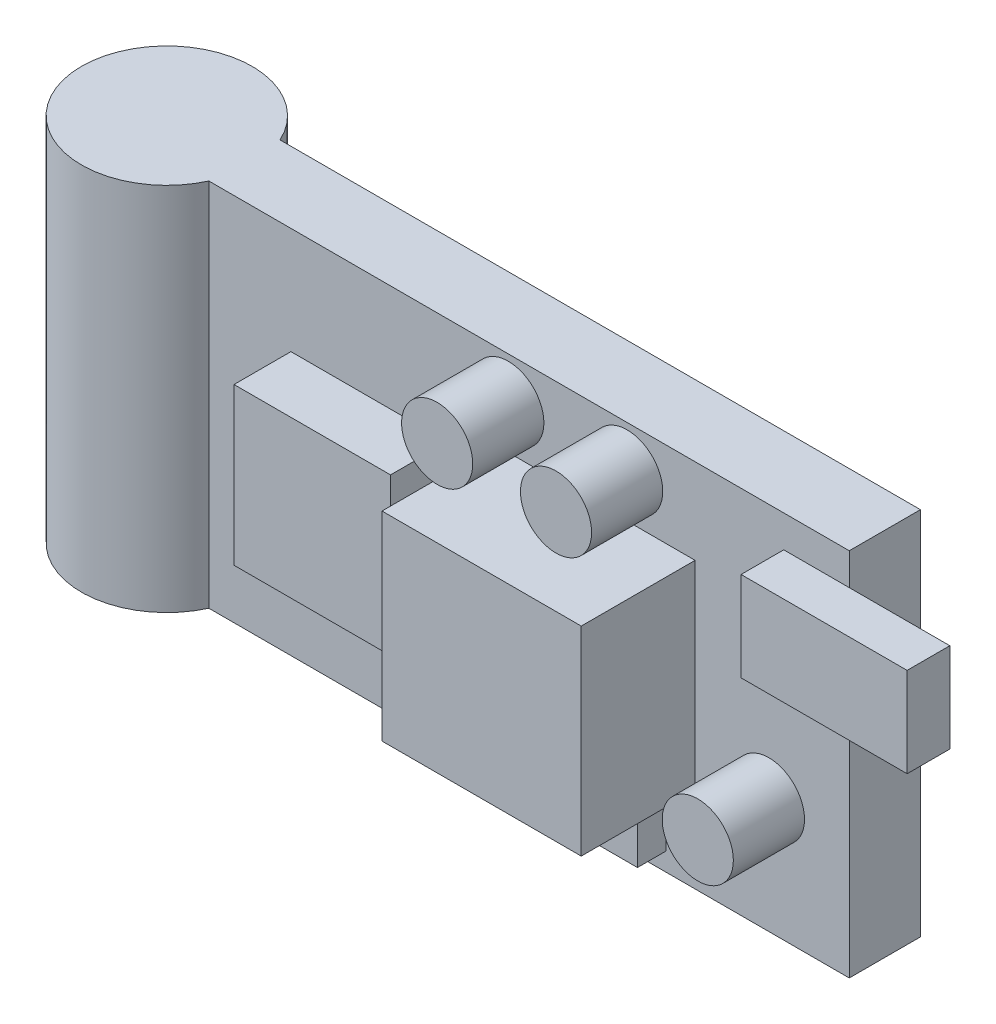
ISO-10303-21;
HEADER;
FILE_DESCRIPTION(('STEP AP214'),'2;1');
FILE_NAME('part.step','',(''),(''),'','','');
FILE_SCHEMA(('AUTOMOTIVE_DESIGN { 1 0 10303 214 1 1 1 1 }'));
ENDSEC;
DATA;
#1=APPLICATION_CONTEXT('core data for automotive mechanical design processes');
#2=APPLICATION_PROTOCOL_DEFINITION('international standard','automotive_design',2000,#1);
#3=PRODUCT_CONTEXT('',#1,'mechanical');
#4=PRODUCT('Part','Part','',(#3));
#5=PRODUCT_RELATED_PRODUCT_CATEGORY('part','',(#4));
#6=PRODUCT_DEFINITION_FORMATION('','',#4);
#7=PRODUCT_DEFINITION_CONTEXT('part definition',#1,'design');
#8=PRODUCT_DEFINITION('design','',#6,#7);
#9=PRODUCT_DEFINITION_SHAPE('','',#8);
#10=(LENGTH_UNIT() NAMED_UNIT(*) SI_UNIT(.MILLI.,.METRE.));
#11=(NAMED_UNIT(*) PLANE_ANGLE_UNIT() SI_UNIT($,.RADIAN.));
#12=(NAMED_UNIT(*) SI_UNIT($,.STERADIAN.) SOLID_ANGLE_UNIT());
#13=UNCERTAINTY_MEASURE_WITH_UNIT(LENGTH_MEASURE(1.E-05),#10,'distance_accuracy_value','');
#14=(GEOMETRIC_REPRESENTATION_CONTEXT(3) GLOBAL_UNCERTAINTY_ASSIGNED_CONTEXT((#13)) GLOBAL_UNIT_ASSIGNED_CONTEXT((#10,
#11,#12)) REPRESENTATION_CONTEXT('',''));
#15=CARTESIAN_POINT('',(0.,0.,0.));
#16=DIRECTION('',(0.,0.,1.));
#17=DIRECTION('',(1.,0.,0.));
#18=AXIS2_PLACEMENT_3D('',#15,#16,#17);
#19=CARTESIAN_POINT('',(0.,0.,5.));
#20=DIRECTION('',(0.,0.,1.));
#21=DIRECTION('',(1.,0.,0.));
#22=AXIS2_PLACEMENT_3D('',#19,#20,#21);
#23=PLANE('',#22);
#24=DIRECTION('',(-1.,0.,0.));
#25=VECTOR('',#24,1.);
#26=CARTESIAN_POINT('',(3.55374490987883,-8.13201384990387,5.));
#27=LINE('',#26,#25);
#28=CARTESIAN_POINT('',(9.61666887440308,-8.13201384990387,5.));
#29=VERTEX_POINT('',#28);
#30=CARTESIAN_POINT('',(3.55374490987883,-8.13201384990387,5.));
#31=VERTEX_POINT('',#30);
#32=EDGE_CURVE('E230',#29,#31,#27,.T.);
#33=ORIENTED_EDGE('',*,*,#32,.F.);
#34=DIRECTION('',(0.,1.,0.));
#35=VECTOR('',#34,1.);
#36=CARTESIAN_POINT('',(9.61666887440308,-8.13201384990387,5.));
#37=LINE('',#36,#35);
#38=CARTESIAN_POINT('',(9.61666887440308,-11.7202749717652,5.));
#39=VERTEX_POINT('',#38);
#40=EDGE_CURVE('E227',#39,#29,#37,.T.);
#41=ORIENTED_EDGE('',*,*,#40,.F.);
#42=DIRECTION('',(1.,0.,0.));
#43=VECTOR('',#42,1.);
#44=CARTESIAN_POINT('',(3.55374490987883,-11.7202749717652,5.));
#45=LINE('',#44,#43);
#46=CARTESIAN_POINT('',(3.55374490987883,-11.7202749717652,5.));
#47=VERTEX_POINT('',#46);
#48=EDGE_CURVE('E240',#47,#39,#45,.T.);
#49=ORIENTED_EDGE('',*,*,#48,.F.);
#50=DIRECTION('',(0.,-1.,0.));
#51=VECTOR('',#50,1.);
#52=CARTESIAN_POINT('',(3.55374490987883,-8.13201384990387,5.));
#53=LINE('',#52,#51);
#54=EDGE_CURVE('E248',#31,#47,#53,.T.);
#55=ORIENTED_EDGE('',*,*,#54,.F.);
#56=EDGE_LOOP('',(#33,#41,#49,#55));
#57=FACE_BOUND('',#56,.T.);
#58=DIRECTION('',(-1.,0.,0.));
#59=VECTOR('',#58,1.);
#60=CARTESIAN_POINT('',(-16.733302853584,5.5,5.));
#61=LINE('',#60,#59);
#62=CARTESIAN_POINT('',(-5.73330285358401,5.5,5.));
#63=VERTEX_POINT('',#62);
#64=CARTESIAN_POINT('',(-16.733302853584,5.5,5.));
#65=VERTEX_POINT('',#64);
#66=EDGE_CURVE('E304',#63,#65,#61,.T.);
#67=ORIENTED_EDGE('',*,*,#66,.F.);
#68=DIRECTION('',(0.,1.,0.));
#69=VECTOR('',#68,1.);
#70=CARTESIAN_POINT('',(-5.73330285358401,5.5,5.));
#71=LINE('',#70,#69);
#72=CARTESIAN_POINT('',(-5.733302853584,-5.5,5.));
#73=VERTEX_POINT('',#72);
#74=EDGE_CURVE('E290',#73,#63,#71,.T.);
#75=ORIENTED_EDGE('',*,*,#74,.F.);
#76=DIRECTION('',(1.,0.,0.));
#77=VECTOR('',#76,1.);
#78=CARTESIAN_POINT('',(-16.733302853584,-5.5,5.));
#79=LINE('',#78,#77);
#80=CARTESIAN_POINT('',(-16.733302853584,-5.5,5.));
#81=VERTEX_POINT('',#80);
#82=EDGE_CURVE('E295',#81,#73,#79,.T.);
#83=ORIENTED_EDGE('',*,*,#82,.F.);
#84=DIRECTION('',(0.,-1.,0.));
#85=VECTOR('',#84,1.);
#86=CARTESIAN_POINT('',(-16.733302853584,5.5,5.));
#87=LINE('',#86,#85);
#88=EDGE_CURVE('E306',#65,#81,#87,.T.);
#89=ORIENTED_EDGE('',*,*,#88,.F.);
#90=EDGE_LOOP('',(#67,#75,#83,#89));
#91=FACE_BOUND('',#90,.T.);
#92=CARTESIAN_POINT('',(6.89360246892216,10.0533177983183,5.));
#93=DIRECTION('',(0.,0.,1.));
#94=DIRECTION('',(1.,0.,0.));
#95=AXIS2_PLACEMENT_3D('',#92,#93,#94);
#96=CIRCLE('',#95,2.5);
#97=CARTESIAN_POINT('',(9.39360246892216,10.0533177983183,5.));
#98=VERTEX_POINT('',#97);
#99=EDGE_CURVE('E323',#98,#98,#96,.T.);
#100=ORIENTED_EDGE('',*,*,#99,.F.);
#101=EDGE_LOOP('',(#100));
#102=FACE_BOUND('',#101,.T.);
#103=DIRECTION('',(-1.,0.,0.));
#104=VECTOR('',#103,1.);
#105=CARTESIAN_POINT('',(-2.3335940894745,7.,5.));
#106=LINE('',#105,#104);
#107=CARTESIAN_POINT('',(11.6664059105255,7.,5.));
#108=VERTEX_POINT('',#107);
#109=CARTESIAN_POINT('',(-2.3335940894745,7.,5.));
#110=VERTEX_POINT('',#109);
#111=EDGE_CURVE('E351',#108,#110,#106,.T.);
#112=ORIENTED_EDGE('',*,*,#111,.F.);
#113=DIRECTION('',(0.,1.,0.));
#114=VECTOR('',#113,1.);
#115=CARTESIAN_POINT('',(11.6664059105255,7.,5.));
#116=LINE('',#115,#114);
#117=CARTESIAN_POINT('',(11.6664059105255,-7.,5.));
#118=VERTEX_POINT('',#117);
#119=EDGE_CURVE('E335',#118,#108,#116,.T.);
#120=ORIENTED_EDGE('',*,*,#119,.F.);
#121=DIRECTION('',(1.,0.,0.));
#122=VECTOR('',#121,1.);
#123=CARTESIAN_POINT('',(-2.3335940894745,-7.,5.));
#124=LINE('',#123,#122);
#125=CARTESIAN_POINT('',(-2.3335940894745,-7.,5.));
#126=VERTEX_POINT('',#125);
#127=EDGE_CURVE('E342',#126,#118,#124,.T.);
#128=ORIENTED_EDGE('',*,*,#127,.F.);
#129=DIRECTION('',(0.,-1.,0.));
#130=VECTOR('',#129,1.);
#131=CARTESIAN_POINT('',(-2.3335940894745,7.,5.));
#132=LINE('',#131,#130);
#133=EDGE_CURVE('E353',#110,#126,#132,.T.);
#134=ORIENTED_EDGE('',*,*,#133,.F.);
#135=EDGE_LOOP('',(#112,#120,#128,#134));
#136=FACE_BOUND('',#135,.T.);
#137=CARTESIAN_POINT('',(-1.45838462506532,10.0533177983183,5.));
#138=DIRECTION('',(0.,0.,1.));
#139=DIRECTION('',(1.,0.,0.));
#140=AXIS2_PLACEMENT_3D('',#137,#138,#139);
#141=CIRCLE('',#140,2.5);
#142=CARTESIAN_POINT('',(1.04161537493468,10.0533177983183,5.));
#143=VERTEX_POINT('',#142);
#144=EDGE_CURVE('E329',#143,#143,#141,.T.);
#145=ORIENTED_EDGE('',*,*,#144,.F.);
#146=EDGE_LOOP('',(#145));
#147=FACE_BOUND('',#146,.T.);
#148=CARTESIAN_POINT('',(16.8541204106406,-4.91839239979261,5.));
#149=DIRECTION('',(0.,0.,1.));
#150=DIRECTION('',(1.,0.,0.));
#151=AXIS2_PLACEMENT_3D('',#148,#149,#150);
#152=CIRCLE('',#151,2.5);
#153=CARTESIAN_POINT('',(19.3541204106406,-4.91839239979261,5.));
#154=VERTEX_POINT('',#153);
#155=EDGE_CURVE('E319',#154,#154,#152,.T.);
#156=ORIENTED_EDGE('',*,*,#155,.F.);
#157=EDGE_LOOP('',(#156));
#158=FACE_BOUND('',#157,.T.);
#159=DIRECTION('',(-1.,0.,0.));
#160=VECTOR('',#159,1.);
#161=CARTESIAN_POINT('',(-5.37305686920241,-8.13201384990387,5.));
#162=LINE('',#161,#160);
#163=CARTESIAN_POINT('',(0.813600237454998,-8.13201384990387,5.));
#164=VERTEX_POINT('',#163);
#165=CARTESIAN_POINT('',(-5.37305686920241,-8.13201384990387,5.));
#166=VERTEX_POINT('',#165);
#167=EDGE_CURVE('E275',#164,#166,#162,.T.);
#168=ORIENTED_EDGE('',*,*,#167,.F.);
#169=DIRECTION('',(0.,1.,0.));
#170=VECTOR('',#169,1.);
#171=CARTESIAN_POINT('',(0.813600237454998,-8.13201384990387,5.));
#172=LINE('',#171,#170);
#173=CARTESIAN_POINT('',(0.813600237454998,-11.7202749717652,5.));
#174=VERTEX_POINT('',#173);
#175=EDGE_CURVE('E261',#174,#164,#172,.T.);
#176=ORIENTED_EDGE('',*,*,#175,.F.);
#177=DIRECTION('',(1.,0.,0.));
#178=VECTOR('',#177,1.);
#179=CARTESIAN_POINT('',(-5.37305686920241,-11.7202749717652,5.));
#180=LINE('',#179,#178);
#181=CARTESIAN_POINT('',(-5.37305686920241,-11.7202749717652,5.));
#182=VERTEX_POINT('',#181);
#183=EDGE_CURVE('E266',#182,#174,#180,.T.);
#184=ORIENTED_EDGE('',*,*,#183,.F.);
#185=DIRECTION('',(0.,-1.,0.));
#186=VECTOR('',#185,1.);
#187=CARTESIAN_POINT('',(-5.37305686920241,-8.13201384990387,5.));
#188=LINE('',#187,#186);
#189=EDGE_CURVE('E277',#166,#182,#188,.T.);
#190=ORIENTED_EDGE('',*,*,#189,.F.);
#191=EDGE_LOOP('',(#168,#176,#184,#190));
#192=FACE_BOUND('',#191,.T.);
#193=DIRECTION('',(0.,-1.,0.));
#194=VECTOR('',#193,1.);
#195=CARTESIAN_POINT('',(17.8958647302189,10.7539535640701,5.));
#196=LINE('',#195,#194);
#197=CARTESIAN_POINT('',(17.8958647302189,10.7539535640701,5.));
#198=VERTEX_POINT('',#197);
#199=CARTESIAN_POINT('',(17.8958647302189,4.46274853657629,5.));
#200=VERTEX_POINT('',#199);
#201=EDGE_CURVE('E50',#198,#200,#196,.T.);
#202=ORIENTED_EDGE('',*,*,#201,.F.);
#203=DIRECTION('',(-1.,0.,0.));
#204=VECTOR('',#203,1.);
#205=CARTESIAN_POINT('',(17.8958647302189,10.7539535640701,5.));
#206=LINE('',#205,#204);
#207=CARTESIAN_POINT('',(22.5,10.7539535640701,5.));
#208=VERTEX_POINT('',#207);
#209=EDGE_CURVE('E407',#208,#198,#206,.T.);
#210=ORIENTED_EDGE('',*,*,#209,.F.);
#211=DIRECTION('',(0.,1.,0.));
#212=VECTOR('',#211,1.);
#213=CARTESIAN_POINT('',(22.5,13.,5.));
#214=LINE('',#213,#212);
#215=CARTESIAN_POINT('',(22.5,13.,5.));
#216=VERTEX_POINT('',#215);
#217=EDGE_CURVE('E377',#208,#216,#214,.T.);
#218=ORIENTED_EDGE('',*,*,#217,.T.);
#219=DIRECTION('',(-1.,0.,0.));
#220=VECTOR('',#219,1.);
#221=CARTESIAN_POINT('',(-22.5,13.,5.));
#222=LINE('',#221,#220);
#223=CARTESIAN_POINT('',(-22.5,13.,5.));
#224=VERTEX_POINT('',#223);
#225=EDGE_CURVE('E375',#216,#224,#222,.T.);
#226=ORIENTED_EDGE('',*,*,#225,.T.);
#227=DIRECTION('',(0.,-1.,0.));
#228=VECTOR('',#227,1.);
#229=CARTESIAN_POINT('',(-22.5,13.,5.));
#230=LINE('',#229,#228);
#231=CARTESIAN_POINT('',(-22.5,-13.,5.));
#232=VERTEX_POINT('',#231);
#233=EDGE_CURVE('E379',#224,#232,#230,.T.);
#234=ORIENTED_EDGE('',*,*,#233,.T.);
#235=DIRECTION('',(1.,0.,0.));
#236=VECTOR('',#235,1.);
#237=CARTESIAN_POINT('',(-22.5,-13.,5.));
#238=LINE('',#237,#236);
#239=CARTESIAN_POINT('',(22.5,-13.,5.));
#240=VERTEX_POINT('',#239);
#241=EDGE_CURVE('E381',#232,#240,#238,.T.);
#242=ORIENTED_EDGE('',*,*,#241,.T.);
#243=CARTESIAN_POINT('',(22.5,4.4627485365763,5.));
#244=VERTEX_POINT('',#243);
#245=EDGE_CURVE('E373',#240,#244,#214,.T.);
#246=ORIENTED_EDGE('',*,*,#245,.T.);
#247=DIRECTION('',(1.,0.,0.));
#248=VECTOR('',#247,1.);
#249=CARTESIAN_POINT('',(17.8958647302189,4.46274853657629,5.));
#250=LINE('',#249,#248);
#251=EDGE_CURVE('E55',#200,#244,#250,.T.);
#252=ORIENTED_EDGE('',*,*,#251,.F.);
#253=EDGE_LOOP('',(#202,#210,#218,#226,#234,#242,#246,#252));
#254=FACE_BOUND('',#253,.T.);
#255=ADVANCED_FACE('F35',(#57,#91,#102,#136,#147,#158,#192,#254),#23,.T.);
#256=CARTESIAN_POINT('',(22.5,13.,5.));
#257=DIRECTION('',(-1.,0.,0.));
#258=DIRECTION('',(0.,-1.,0.));
#259=AXIS2_PLACEMENT_3D('',#256,#257,#258);
#260=PLANE('',#259);
#261=DIRECTION('',(0.,1.,0.));
#262=VECTOR('',#261,1.);
#263=CARTESIAN_POINT('',(22.5,13.,0.));
#264=LINE('',#263,#262);
#265=CARTESIAN_POINT('',(22.5,-13.,0.));
#266=VERTEX_POINT('',#265);
#267=CARTESIAN_POINT('',(22.5,13.,0.));
#268=VERTEX_POINT('',#267);
#269=EDGE_CURVE('E372',#266,#268,#264,.T.);
#270=ORIENTED_EDGE('',*,*,#269,.T.);
#271=DIRECTION('',(0.,0.,-1.));
#272=VECTOR('',#271,1.);
#273=CARTESIAN_POINT('',(22.5,13.,5.));
#274=LINE('',#273,#272);
#275=EDGE_CURVE('E11',#216,#268,#274,.T.);
#276=ORIENTED_EDGE('',*,*,#275,.F.);
#277=ORIENTED_EDGE('',*,*,#217,.F.);
#278=EDGE_CURVE('E376',#244,#208,#214,.T.);
#279=ORIENTED_EDGE('',*,*,#278,.F.);
#280=ORIENTED_EDGE('',*,*,#245,.F.);
#281=DIRECTION('',(0.,0.,-1.));
#282=VECTOR('',#281,1.);
#283=CARTESIAN_POINT('',(22.5,-13.,5.));
#284=LINE('',#283,#282);
#285=EDGE_CURVE('E43',#240,#266,#284,.T.);
#286=ORIENTED_EDGE('',*,*,#285,.T.);
#287=EDGE_LOOP('',(#270,#276,#277,#279,#280,#286));
#288=FACE_BOUND('',#287,.T.);
#289=ADVANCED_FACE('F37',(#288),#260,.F.);
#290=CARTESIAN_POINT('',(-22.5,13.,5.));
#291=DIRECTION('',(0.,-1.,0.));
#292=DIRECTION('',(0.,0.,-1.));
#293=AXIS2_PLACEMENT_3D('',#290,#291,#292);
#294=PLANE('',#293);
#295=DIRECTION('',(-1.,0.,0.));
#296=VECTOR('',#295,1.);
#297=CARTESIAN_POINT('',(-22.5,13.,0.));
#298=LINE('',#297,#296);
#299=CARTESIAN_POINT('',(-22.5,13.,0.));
#300=VERTEX_POINT('',#299);
#301=EDGE_CURVE('E385',#268,#300,#298,.T.);
#302=ORIENTED_EDGE('',*,*,#301,.T.);
#303=CARTESIAN_POINT('',(-27.9543560573179,13.,2.5));
#304=DIRECTION('',(0.,1.,0.));
#305=DIRECTION('',(0.,0.,1.));
#306=AXIS2_PLACEMENT_3D('',#303,#304,#305);
#307=CIRCLE('',#306,6.);
#308=EDGE_CURVE('E366',#300,#224,#307,.T.);
#309=ORIENTED_EDGE('',*,*,#308,.T.);
#310=ORIENTED_EDGE('',*,*,#225,.F.);
#311=ORIENTED_EDGE('',*,*,#275,.T.);
#312=EDGE_LOOP('',(#302,#309,#310,#311));
#313=FACE_BOUND('',#312,.T.);
#314=ADVANCED_FACE('F405',(#313),#294,.F.);
#315=CARTESIAN_POINT('',(-22.5,-13.,5.));
#316=DIRECTION('',(0.,1.,0.));
#317=DIRECTION('',(0.,0.,1.));
#318=AXIS2_PLACEMENT_3D('',#315,#316,#317);
#319=PLANE('',#318);
#320=ORIENTED_EDGE('',*,*,#241,.F.);
#321=CARTESIAN_POINT('',(-27.9543560573179,-13.,2.5));
#322=DIRECTION('',(0.,1.,0.));
#323=DIRECTION('',(0.,0.,1.));
#324=AXIS2_PLACEMENT_3D('',#321,#322,#323);
#325=CIRCLE('',#324,6.);
#326=CARTESIAN_POINT('',(-22.5,-13.,0.));
#327=VERTEX_POINT('',#326);
#328=EDGE_CURVE('E369',#232,#327,#325,.F.);
#329=ORIENTED_EDGE('',*,*,#328,.T.);
#330=DIRECTION('',(1.,0.,0.));
#331=VECTOR('',#330,1.);
#332=CARTESIAN_POINT('',(-22.5,-13.,0.));
#333=LINE('',#332,#331);
#334=EDGE_CURVE('E390',#327,#266,#333,.T.);
#335=ORIENTED_EDGE('',*,*,#334,.T.);
#336=ORIENTED_EDGE('',*,*,#285,.F.);
#337=EDGE_LOOP('',(#320,#329,#335,#336));
#338=FACE_BOUND('',#337,.T.);
#339=ADVANCED_FACE('F449',(#338),#319,.F.);
#340=CARTESIAN_POINT('',(0.,0.,0.));
#341=DIRECTION('',(0.,0.,1.));
#342=DIRECTION('',(1.,0.,0.));
#343=AXIS2_PLACEMENT_3D('',#340,#341,#342);
#344=PLANE('',#343);
#345=ORIENTED_EDGE('',*,*,#269,.F.);
#346=ORIENTED_EDGE('',*,*,#334,.F.);
#347=DIRECTION('',(0.,-1.,0.));
#348=VECTOR('',#347,1.);
#349=CARTESIAN_POINT('',(-22.5,13.,0.));
#350=LINE('',#349,#348);
#351=EDGE_CURVE('E387',#300,#327,#350,.T.);
#352=ORIENTED_EDGE('',*,*,#351,.F.);
#353=ORIENTED_EDGE('',*,*,#301,.F.);
#354=EDGE_LOOP('',(#345,#346,#352,#353));
#355=FACE_BOUND('',#354,.T.);
#356=ADVANCED_FACE('F400',(#355),#344,.F.);
#357=CARTESIAN_POINT('',(-27.9543560573179,-29.9705627484771,2.5));
#358=DIRECTION('',(0.,1.,0.));
#359=DIRECTION('',(0.,0.,1.));
#360=AXIS2_PLACEMENT_3D('',#357,#358,#359);
#361=CYLINDRICAL_SURFACE('',#360,6.);
#362=ORIENTED_EDGE('',*,*,#328,.F.);
#363=ORIENTED_EDGE('',*,*,#233,.F.);
#364=ORIENTED_EDGE('',*,*,#308,.F.);
#365=ORIENTED_EDGE('',*,*,#351,.T.);
#366=EDGE_LOOP('',(#362,#363,#364,#365));
#367=FACE_BOUND('',#366,.T.);
#368=ADVANCED_FACE('F445',(#367),#361,.T.);
#369=CARTESIAN_POINT('',(11.6664059105255,7.,13.));
#370=DIRECTION('',(-1.,0.,0.));
#371=DIRECTION('',(0.,-1.,0.));
#372=AXIS2_PLACEMENT_3D('',#369,#370,#371);
#373=PLANE('',#372);
#374=ORIENTED_EDGE('',*,*,#119,.T.);
#375=DIRECTION('',(0.,0.,-1.));
#376=VECTOR('',#375,1.);
#377=CARTESIAN_POINT('',(11.6664059105255,7.,13.));
#378=LINE('',#377,#376);
#379=CARTESIAN_POINT('',(11.6664059105255,7.,13.));
#380=VERTEX_POINT('',#379);
#381=EDGE_CURVE('E364',#380,#108,#378,.T.);
#382=ORIENTED_EDGE('',*,*,#381,.F.);
#383=DIRECTION('',(0.,1.,0.));
#384=VECTOR('',#383,1.);
#385=CARTESIAN_POINT('',(11.6664059105255,7.,13.));
#386=LINE('',#385,#384);
#387=CARTESIAN_POINT('',(11.6664059105255,-7.,13.));
#388=VERTEX_POINT('',#387);
#389=EDGE_CURVE('E338',#388,#380,#386,.T.);
#390=ORIENTED_EDGE('',*,*,#389,.F.);
#391=DIRECTION('',(0.,0.,-1.));
#392=VECTOR('',#391,1.);
#393=CARTESIAN_POINT('',(11.6664059105255,-7.,13.));
#394=LINE('',#393,#392);
#395=EDGE_CURVE('E348',#388,#118,#394,.T.);
#396=ORIENTED_EDGE('',*,*,#395,.T.);
#397=EDGE_LOOP('',(#374,#382,#390,#396));
#398=FACE_BOUND('',#397,.T.);
#399=ADVANCED_FACE('F470',(#398),#373,.F.);
#400=CARTESIAN_POINT('',(-2.3335940894745,7.,13.));
#401=DIRECTION('',(0.,-1.,0.));
#402=DIRECTION('',(0.,0.,-1.));
#403=AXIS2_PLACEMENT_3D('',#400,#401,#402);
#404=PLANE('',#403);
#405=ORIENTED_EDGE('',*,*,#111,.T.);
#406=DIRECTION('',(0.,0.,-1.));
#407=VECTOR('',#406,1.);
#408=CARTESIAN_POINT('',(-2.3335940894745,7.,13.));
#409=LINE('',#408,#407);
#410=CARTESIAN_POINT('',(-2.3335940894745,7.,13.));
#411=VERTEX_POINT('',#410);
#412=EDGE_CURVE('E361',#411,#110,#409,.T.);
#413=ORIENTED_EDGE('',*,*,#412,.F.);
#414=DIRECTION('',(-1.,0.,0.));
#415=VECTOR('',#414,1.);
#416=CARTESIAN_POINT('',(-2.3335940894745,7.,13.));
#417=LINE('',#416,#415);
#418=EDGE_CURVE('E341',#380,#411,#417,.T.);
#419=ORIENTED_EDGE('',*,*,#418,.F.);
#420=ORIENTED_EDGE('',*,*,#381,.T.);
#421=EDGE_LOOP('',(#405,#413,#419,#420));
#422=FACE_BOUND('',#421,.T.);
#423=ADVANCED_FACE('F477',(#422),#404,.F.);
#424=CARTESIAN_POINT('',(-2.3335940894745,7.,13.));
#425=DIRECTION('',(1.,0.,0.));
#426=DIRECTION('',(0.,1.,0.));
#427=AXIS2_PLACEMENT_3D('',#424,#425,#426);
#428=PLANE('',#427);
#429=ORIENTED_EDGE('',*,*,#133,.T.);
#430=DIRECTION('',(0.,0.,-1.));
#431=VECTOR('',#430,1.);
#432=CARTESIAN_POINT('',(-2.3335940894745,-7.,13.));
#433=LINE('',#432,#431);
#434=CARTESIAN_POINT('',(-2.3335940894745,-7.,13.));
#435=VERTEX_POINT('',#434);
#436=EDGE_CURVE('E359',#435,#126,#433,.T.);
#437=ORIENTED_EDGE('',*,*,#436,.F.);
#438=DIRECTION('',(0.,-1.,0.));
#439=VECTOR('',#438,1.);
#440=CARTESIAN_POINT('',(-2.3335940894745,7.,13.));
#441=LINE('',#440,#439);
#442=EDGE_CURVE('E344',#411,#435,#441,.T.);
#443=ORIENTED_EDGE('',*,*,#442,.F.);
#444=ORIENTED_EDGE('',*,*,#412,.T.);
#445=EDGE_LOOP('',(#429,#437,#443,#444));
#446=FACE_BOUND('',#445,.T.);
#447=ADVANCED_FACE('F484',(#446),#428,.F.);
#448=CARTESIAN_POINT('',(-2.3335940894745,-7.,13.));
#449=DIRECTION('',(0.,1.,0.));
#450=DIRECTION('',(0.,0.,1.));
#451=AXIS2_PLACEMENT_3D('',#448,#449,#450);
#452=PLANE('',#451);
#453=ORIENTED_EDGE('',*,*,#127,.T.);
#454=ORIENTED_EDGE('',*,*,#395,.F.);
#455=DIRECTION('',(1.,0.,0.));
#456=VECTOR('',#455,1.);
#457=CARTESIAN_POINT('',(-2.3335940894745,-7.,13.));
#458=LINE('',#457,#456);
#459=EDGE_CURVE('E346',#435,#388,#458,.T.);
#460=ORIENTED_EDGE('',*,*,#459,.F.);
#461=ORIENTED_EDGE('',*,*,#436,.T.);
#462=EDGE_LOOP('',(#453,#454,#460,#461));
#463=FACE_BOUND('',#462,.T.);
#464=ADVANCED_FACE('F492',(#463),#452,.F.);
#465=CARTESIAN_POINT('',(0.,0.,13.));
#466=DIRECTION('',(0.,0.,1.));
#467=DIRECTION('',(1.,0.,0.));
#468=AXIS2_PLACEMENT_3D('',#465,#466,#467);
#469=PLANE('',#468);
#470=ORIENTED_EDGE('',*,*,#389,.T.);
#471=ORIENTED_EDGE('',*,*,#418,.T.);
#472=ORIENTED_EDGE('',*,*,#442,.T.);
#473=ORIENTED_EDGE('',*,*,#459,.T.);
#474=EDGE_LOOP('',(#470,#471,#472,#473));
#475=FACE_BOUND('',#474,.T.);
#476=ADVANCED_FACE('F500',(#475),#469,.T.);
#477=CARTESIAN_POINT('',(-1.45838462506532,10.0533177983183,10.));
#478=DIRECTION('',(0.,0.,-1.));
#479=DIRECTION('',(-1.,0.,0.));
#480=AXIS2_PLACEMENT_3D('',#477,#478,#479);
#481=CYLINDRICAL_SURFACE('',#480,2.5);
#482=CARTESIAN_POINT('',(-1.45838462506532,10.0533177983183,10.));
#483=DIRECTION('',(0.,0.,1.));
#484=DIRECTION('',(1.,0.,0.));
#485=AXIS2_PLACEMENT_3D('',#482,#483,#484);
#486=CIRCLE('',#485,2.5);
#487=CARTESIAN_POINT('',(1.04161537493468,10.0533177983183,10.));
#488=VERTEX_POINT('',#487);
#489=EDGE_CURVE('E332',#488,#488,#486,.T.);
#490=ORIENTED_EDGE('',*,*,#489,.F.);
#491=EDGE_LOOP('',(#490));
#492=FACE_BOUND('',#491,.T.);
#493=ORIENTED_EDGE('',*,*,#144,.T.);
#494=EDGE_LOOP('',(#493));
#495=FACE_BOUND('',#494,.T.);
#496=ADVANCED_FACE('F508',(#492,#495),#481,.T.);
#497=CARTESIAN_POINT('',(-1.45838462506532,10.0533177983183,10.));
#498=DIRECTION('',(0.,0.,1.));
#499=DIRECTION('',(1.,0.,0.));
#500=AXIS2_PLACEMENT_3D('',#497,#498,#499);
#501=PLANE('',#500);
#502=ORIENTED_EDGE('',*,*,#489,.T.);
#503=EDGE_LOOP('',(#502));
#504=FACE_BOUND('',#503,.T.);
#505=ADVANCED_FACE('F516',(#504),#501,.T.);
#506=CARTESIAN_POINT('',(6.89360246892216,10.0533177983183,10.));
#507=DIRECTION('',(0.,0.,-1.));
#508=DIRECTION('',(-1.,0.,0.));
#509=AXIS2_PLACEMENT_3D('',#506,#507,#508);
#510=CYLINDRICAL_SURFACE('',#509,2.5);
#511=CARTESIAN_POINT('',(6.89360246892216,10.0533177983183,10.));
#512=DIRECTION('',(0.,0.,1.));
#513=DIRECTION('',(1.,0.,0.));
#514=AXIS2_PLACEMENT_3D('',#511,#512,#513);
#515=CIRCLE('',#514,2.5);
#516=CARTESIAN_POINT('',(9.39360246892216,10.0533177983183,10.));
#517=VERTEX_POINT('',#516);
#518=EDGE_CURVE('E326',#517,#517,#515,.T.);
#519=ORIENTED_EDGE('',*,*,#518,.F.);
#520=EDGE_LOOP('',(#519));
#521=FACE_BOUND('',#520,.T.);
#522=ORIENTED_EDGE('',*,*,#99,.T.);
#523=EDGE_LOOP('',(#522));
#524=FACE_BOUND('',#523,.T.);
#525=ADVANCED_FACE('F524',(#521,#524),#510,.T.);
#526=CARTESIAN_POINT('',(6.89360246892216,10.0533177983183,10.));
#527=DIRECTION('',(0.,0.,1.));
#528=DIRECTION('',(1.,0.,0.));
#529=AXIS2_PLACEMENT_3D('',#526,#527,#528);
#530=PLANE('',#529);
#531=ORIENTED_EDGE('',*,*,#518,.T.);
#532=EDGE_LOOP('',(#531));
#533=FACE_BOUND('',#532,.T.);
#534=ADVANCED_FACE('F532',(#533),#530,.T.);
#535=CARTESIAN_POINT('',(16.8541204106406,-4.91839239979261,10.));
#536=DIRECTION('',(0.,0.,-1.));
#537=DIRECTION('',(-1.,0.,0.));
#538=AXIS2_PLACEMENT_3D('',#535,#536,#537);
#539=CYLINDRICAL_SURFACE('',#538,2.5);
#540=CARTESIAN_POINT('',(16.8541204106406,-4.91839239979261,10.));
#541=DIRECTION('',(0.,0.,1.));
#542=DIRECTION('',(1.,0.,0.));
#543=AXIS2_PLACEMENT_3D('',#540,#541,#542);
#544=CIRCLE('',#543,2.5);
#545=CARTESIAN_POINT('',(19.3541204106406,-4.91839239979261,10.));
#546=VERTEX_POINT('',#545);
#547=EDGE_CURVE('E320',#546,#546,#544,.T.);
#548=ORIENTED_EDGE('',*,*,#547,.F.);
#549=EDGE_LOOP('',(#548));
#550=FACE_BOUND('',#549,.T.);
#551=ORIENTED_EDGE('',*,*,#155,.T.);
#552=EDGE_LOOP('',(#551));
#553=FACE_BOUND('',#552,.T.);
#554=ADVANCED_FACE('F540',(#550,#553),#539,.T.);
#555=CARTESIAN_POINT('',(16.8541204106406,-4.91839239979261,10.));
#556=DIRECTION('',(0.,0.,1.));
#557=DIRECTION('',(1.,0.,0.));
#558=AXIS2_PLACEMENT_3D('',#555,#556,#557);
#559=PLANE('',#558);
#560=ORIENTED_EDGE('',*,*,#547,.T.);
#561=EDGE_LOOP('',(#560));
#562=FACE_BOUND('',#561,.T.);
#563=ADVANCED_FACE('F548',(#562),#559,.T.);
#564=CARTESIAN_POINT('',(-5.73330285358401,5.5,9.));
#565=DIRECTION('',(-1.,0.,0.));
#566=DIRECTION('',(0.,-1.,0.));
#567=AXIS2_PLACEMENT_3D('',#564,#565,#566);
#568=PLANE('',#567);
#569=ORIENTED_EDGE('',*,*,#74,.T.);
#570=DIRECTION('',(0.,0.,-1.));
#571=VECTOR('',#570,1.);
#572=CARTESIAN_POINT('',(-5.73330285358401,5.5,9.));
#573=LINE('',#572,#571);
#574=CARTESIAN_POINT('',(-5.73330285358401,5.5,9.));
#575=VERTEX_POINT('',#574);
#576=EDGE_CURVE('E317',#575,#63,#573,.T.);
#577=ORIENTED_EDGE('',*,*,#576,.F.);
#578=DIRECTION('',(0.,1.,0.));
#579=VECTOR('',#578,1.);
#580=CARTESIAN_POINT('',(-5.73330285358401,5.5,9.));
#581=LINE('',#580,#579);
#582=CARTESIAN_POINT('',(-5.733302853584,-5.5,9.));
#583=VERTEX_POINT('',#582);
#584=EDGE_CURVE('E291',#583,#575,#581,.T.);
#585=ORIENTED_EDGE('',*,*,#584,.F.);
#586=DIRECTION('',(0.,0.,-1.));
#587=VECTOR('',#586,1.);
#588=CARTESIAN_POINT('',(-5.733302853584,-5.5,9.));
#589=LINE('',#588,#587);
#590=EDGE_CURVE('E301',#583,#73,#589,.T.);
#591=ORIENTED_EDGE('',*,*,#590,.T.);
#592=EDGE_LOOP('',(#569,#577,#585,#591));
#593=FACE_BOUND('',#592,.T.);
#594=ADVANCED_FACE('F556',(#593),#568,.F.);
#595=CARTESIAN_POINT('',(-16.733302853584,5.5,9.));
#596=DIRECTION('',(0.,-1.,0.));
#597=DIRECTION('',(0.,0.,-1.));
#598=AXIS2_PLACEMENT_3D('',#595,#596,#597);
#599=PLANE('',#598);
#600=ORIENTED_EDGE('',*,*,#66,.T.);
#601=DIRECTION('',(0.,0.,-1.));
#602=VECTOR('',#601,1.);
#603=CARTESIAN_POINT('',(-16.733302853584,5.5,9.));
#604=LINE('',#603,#602);
#605=CARTESIAN_POINT('',(-16.733302853584,5.5,9.));
#606=VERTEX_POINT('',#605);
#607=EDGE_CURVE('E314',#606,#65,#604,.T.);
#608=ORIENTED_EDGE('',*,*,#607,.F.);
#609=DIRECTION('',(-1.,0.,0.));
#610=VECTOR('',#609,1.);
#611=CARTESIAN_POINT('',(-16.733302853584,5.5,9.));
#612=LINE('',#611,#610);
#613=EDGE_CURVE('E294',#575,#606,#612,.T.);
#614=ORIENTED_EDGE('',*,*,#613,.F.);
#615=ORIENTED_EDGE('',*,*,#576,.T.);
#616=EDGE_LOOP('',(#600,#608,#614,#615));
#617=FACE_BOUND('',#616,.T.);
#618=ADVANCED_FACE('F564',(#617),#599,.F.);
#619=CARTESIAN_POINT('',(-16.733302853584,5.5,9.));
#620=DIRECTION('',(1.,0.,0.));
#621=DIRECTION('',(0.,0.,-1.));
#622=AXIS2_PLACEMENT_3D('',#619,#620,#621);
#623=PLANE('',#622);
#624=ORIENTED_EDGE('',*,*,#88,.T.);
#625=DIRECTION('',(0.,0.,-1.));
#626=VECTOR('',#625,1.);
#627=CARTESIAN_POINT('',(-16.733302853584,-5.5,9.));
#628=LINE('',#627,#626);
#629=CARTESIAN_POINT('',(-16.733302853584,-5.5,9.));
#630=VERTEX_POINT('',#629);
#631=EDGE_CURVE('E312',#630,#81,#628,.T.);
#632=ORIENTED_EDGE('',*,*,#631,.F.);
#633=DIRECTION('',(0.,-1.,0.));
#634=VECTOR('',#633,1.);
#635=CARTESIAN_POINT('',(-16.733302853584,5.5,9.));
#636=LINE('',#635,#634);
#637=EDGE_CURVE('E297',#606,#630,#636,.T.);
#638=ORIENTED_EDGE('',*,*,#637,.F.);
#639=ORIENTED_EDGE('',*,*,#607,.T.);
#640=EDGE_LOOP('',(#624,#632,#638,#639));
#641=FACE_BOUND('',#640,.T.);
#642=ADVANCED_FACE('F572',(#641),#623,.F.);
#643=CARTESIAN_POINT('',(-16.733302853584,-5.5,9.));
#644=DIRECTION('',(0.,1.,0.));
#645=DIRECTION('',(0.,0.,1.));
#646=AXIS2_PLACEMENT_3D('',#643,#644,#645);
#647=PLANE('',#646);
#648=ORIENTED_EDGE('',*,*,#82,.T.);
#649=ORIENTED_EDGE('',*,*,#590,.F.);
#650=DIRECTION('',(1.,0.,0.));
#651=VECTOR('',#650,1.);
#652=CARTESIAN_POINT('',(-16.733302853584,-5.5,9.));
#653=LINE('',#652,#651);
#654=EDGE_CURVE('E299',#630,#583,#653,.T.);
#655=ORIENTED_EDGE('',*,*,#654,.F.);
#656=ORIENTED_EDGE('',*,*,#631,.T.);
#657=EDGE_LOOP('',(#648,#649,#655,#656));
#658=FACE_BOUND('',#657,.T.);
#659=ADVANCED_FACE('F580',(#658),#647,.F.);
#660=CARTESIAN_POINT('',(0.,0.,9.));
#661=DIRECTION('',(0.,0.,1.));
#662=DIRECTION('',(1.,0.,0.));
#663=AXIS2_PLACEMENT_3D('',#660,#661,#662);
#664=PLANE('',#663);
#665=ORIENTED_EDGE('',*,*,#584,.T.);
#666=ORIENTED_EDGE('',*,*,#613,.T.);
#667=ORIENTED_EDGE('',*,*,#637,.T.);
#668=ORIENTED_EDGE('',*,*,#654,.T.);
#669=EDGE_LOOP('',(#665,#666,#667,#668));
#670=FACE_BOUND('',#669,.T.);
#671=ADVANCED_FACE('F588',(#670),#664,.T.);
#672=CARTESIAN_POINT('',(0.813600237454998,-8.13201384990387,7.));
#673=DIRECTION('',(-1.,0.,0.));
#674=DIRECTION('',(0.,0.,1.));
#675=AXIS2_PLACEMENT_3D('',#672,#673,#674);
#676=PLANE('',#675);
#677=ORIENTED_EDGE('',*,*,#175,.T.);
#678=DIRECTION('',(0.,0.,-1.));
#679=VECTOR('',#678,1.);
#680=CARTESIAN_POINT('',(0.813600237454998,-8.13201384990387,7.));
#681=LINE('',#680,#679);
#682=CARTESIAN_POINT('',(0.813600237454998,-8.13201384990387,7.));
#683=VERTEX_POINT('',#682);
#684=EDGE_CURVE('E288',#683,#164,#681,.T.);
#685=ORIENTED_EDGE('',*,*,#684,.F.);
#686=DIRECTION('',(0.,1.,0.));
#687=VECTOR('',#686,1.);
#688=CARTESIAN_POINT('',(0.813600237454998,-8.13201384990387,7.));
#689=LINE('',#688,#687);
#690=CARTESIAN_POINT('',(0.813600237454998,-11.7202749717652,7.));
#691=VERTEX_POINT('',#690);
#692=EDGE_CURVE('E262',#691,#683,#689,.T.);
#693=ORIENTED_EDGE('',*,*,#692,.F.);
#694=DIRECTION('',(0.,0.,-1.));
#695=VECTOR('',#694,1.);
#696=CARTESIAN_POINT('',(0.813600237454998,-11.7202749717652,7.));
#697=LINE('',#696,#695);
#698=EDGE_CURVE('E272',#691,#174,#697,.T.);
#699=ORIENTED_EDGE('',*,*,#698,.T.);
#700=EDGE_LOOP('',(#677,#685,#693,#699));
#701=FACE_BOUND('',#700,.T.);
#702=ADVANCED_FACE('F596',(#701),#676,.F.);
#703=CARTESIAN_POINT('',(-5.37305686920241,-8.13201384990387,7.));
#704=DIRECTION('',(0.,-1.,0.));
#705=DIRECTION('',(0.,0.,-1.));
#706=AXIS2_PLACEMENT_3D('',#703,#704,#705);
#707=PLANE('',#706);
#708=ORIENTED_EDGE('',*,*,#167,.T.);
#709=DIRECTION('',(0.,0.,-1.));
#710=VECTOR('',#709,1.);
#711=CARTESIAN_POINT('',(-5.37305686920241,-8.13201384990387,7.));
#712=LINE('',#711,#710);
#713=CARTESIAN_POINT('',(-5.37305686920241,-8.13201384990387,7.));
#714=VERTEX_POINT('',#713);
#715=EDGE_CURVE('E285',#714,#166,#712,.T.);
#716=ORIENTED_EDGE('',*,*,#715,.F.);
#717=DIRECTION('',(-1.,0.,0.));
#718=VECTOR('',#717,1.);
#719=CARTESIAN_POINT('',(-5.37305686920241,-8.13201384990387,7.));
#720=LINE('',#719,#718);
#721=EDGE_CURVE('E265',#683,#714,#720,.T.);
#722=ORIENTED_EDGE('',*,*,#721,.F.);
#723=ORIENTED_EDGE('',*,*,#684,.T.);
#724=EDGE_LOOP('',(#708,#716,#722,#723));
#725=FACE_BOUND('',#724,.T.);
#726=ADVANCED_FACE('F604',(#725),#707,.F.);
#727=CARTESIAN_POINT('',(-5.37305686920241,-8.13201384990387,7.));
#728=DIRECTION('',(1.,0.,0.));
#729=DIRECTION('',(0.,0.,-1.));
#730=AXIS2_PLACEMENT_3D('',#727,#728,#729);
#731=PLANE('',#730);
#732=ORIENTED_EDGE('',*,*,#189,.T.);
#733=DIRECTION('',(0.,0.,-1.));
#734=VECTOR('',#733,1.);
#735=CARTESIAN_POINT('',(-5.37305686920241,-11.7202749717652,7.));
#736=LINE('',#735,#734);
#737=CARTESIAN_POINT('',(-5.37305686920241,-11.7202749717652,7.));
#738=VERTEX_POINT('',#737);
#739=EDGE_CURVE('E283',#738,#182,#736,.T.);
#740=ORIENTED_EDGE('',*,*,#739,.F.);
#741=DIRECTION('',(0.,-1.,0.));
#742=VECTOR('',#741,1.);
#743=CARTESIAN_POINT('',(-5.37305686920241,-8.13201384990387,7.));
#744=LINE('',#743,#742);
#745=EDGE_CURVE('E268',#714,#738,#744,.T.);
#746=ORIENTED_EDGE('',*,*,#745,.F.);
#747=ORIENTED_EDGE('',*,*,#715,.T.);
#748=EDGE_LOOP('',(#732,#740,#746,#747));
#749=FACE_BOUND('',#748,.T.);
#750=ADVANCED_FACE('F612',(#749),#731,.F.);
#751=CARTESIAN_POINT('',(-5.37305686920241,-11.7202749717652,7.));
#752=DIRECTION('',(0.,1.,0.));
#753=DIRECTION('',(0.,0.,1.));
#754=AXIS2_PLACEMENT_3D('',#751,#752,#753);
#755=PLANE('',#754);
#756=ORIENTED_EDGE('',*,*,#183,.T.);
#757=ORIENTED_EDGE('',*,*,#698,.F.);
#758=DIRECTION('',(1.,0.,0.));
#759=VECTOR('',#758,1.);
#760=CARTESIAN_POINT('',(-5.37305686920241,-11.7202749717652,7.));
#761=LINE('',#760,#759);
#762=EDGE_CURVE('E270',#738,#691,#761,.T.);
#763=ORIENTED_EDGE('',*,*,#762,.F.);
#764=ORIENTED_EDGE('',*,*,#739,.T.);
#765=EDGE_LOOP('',(#756,#757,#763,#764));
#766=FACE_BOUND('',#765,.T.);
#767=ADVANCED_FACE('F620',(#766),#755,.F.);
#768=CARTESIAN_POINT('',(0.,0.,7.));
#769=DIRECTION('',(0.,0.,1.));
#770=DIRECTION('',(1.,0.,0.));
#771=AXIS2_PLACEMENT_3D('',#768,#769,#770);
#772=PLANE('',#771);
#773=ORIENTED_EDGE('',*,*,#692,.T.);
#774=ORIENTED_EDGE('',*,*,#721,.T.);
#775=ORIENTED_EDGE('',*,*,#745,.T.);
#776=ORIENTED_EDGE('',*,*,#762,.T.);
#777=EDGE_LOOP('',(#773,#774,#775,#776));
#778=FACE_BOUND('',#777,.T.);
#779=ADVANCED_FACE('F628',(#778),#772,.T.);
#780=CARTESIAN_POINT('',(9.61666887440308,-8.13201384990387,7.));
#781=DIRECTION('',(-1.,0.,0.));
#782=DIRECTION('',(0.,-1.,0.));
#783=AXIS2_PLACEMENT_3D('',#780,#781,#782);
#784=PLANE('',#783);
#785=ORIENTED_EDGE('',*,*,#40,.T.);
#786=DIRECTION('',(0.,0.,-1.));
#787=VECTOR('',#786,1.);
#788=CARTESIAN_POINT('',(9.61666887440308,-8.13201384990387,7.));
#789=LINE('',#788,#787);
#790=CARTESIAN_POINT('',(9.61666887440308,-8.13201384990387,7.));
#791=VERTEX_POINT('',#790);
#792=EDGE_CURVE('E259',#791,#29,#789,.T.);
#793=ORIENTED_EDGE('',*,*,#792,.F.);
#794=DIRECTION('',(0.,1.,0.));
#795=VECTOR('',#794,1.);
#796=CARTESIAN_POINT('',(9.61666887440308,-8.13201384990387,7.));
#797=LINE('',#796,#795);
#798=CARTESIAN_POINT('',(9.61666887440308,-11.7202749717652,7.));
#799=VERTEX_POINT('',#798);
#800=EDGE_CURVE('E236',#799,#791,#797,.T.);
#801=ORIENTED_EDGE('',*,*,#800,.F.);
#802=DIRECTION('',(0.,0.,-1.));
#803=VECTOR('',#802,1.);
#804=CARTESIAN_POINT('',(9.61666887440308,-11.7202749717652,7.));
#805=LINE('',#804,#803);
#806=EDGE_CURVE('E245',#799,#39,#805,.T.);
#807=ORIENTED_EDGE('',*,*,#806,.T.);
#808=EDGE_LOOP('',(#785,#793,#801,#807));
#809=FACE_BOUND('',#808,.T.);
#810=ADVANCED_FACE('F636',(#809),#784,.F.);
#811=CARTESIAN_POINT('',(3.55374490987883,-8.13201384990387,7.));
#812=DIRECTION('',(0.,-1.,0.));
#813=DIRECTION('',(0.,0.,-1.));
#814=AXIS2_PLACEMENT_3D('',#811,#812,#813);
#815=PLANE('',#814);
#816=ORIENTED_EDGE('',*,*,#32,.T.);
#817=DIRECTION('',(0.,0.,-1.));
#818=VECTOR('',#817,1.);
#819=CARTESIAN_POINT('',(3.55374490987883,-8.13201384990387,7.));
#820=LINE('',#819,#818);
#821=CARTESIAN_POINT('',(3.55374490987883,-8.13201384990387,7.));
#822=VERTEX_POINT('',#821);
#823=EDGE_CURVE('E256',#822,#31,#820,.T.);
#824=ORIENTED_EDGE('',*,*,#823,.F.);
#825=DIRECTION('',(-1.,0.,0.));
#826=VECTOR('',#825,1.);
#827=CARTESIAN_POINT('',(3.55374490987883,-8.13201384990387,7.));
#828=LINE('',#827,#826);
#829=EDGE_CURVE('E239',#791,#822,#828,.T.);
#830=ORIENTED_EDGE('',*,*,#829,.F.);
#831=ORIENTED_EDGE('',*,*,#792,.T.);
#832=EDGE_LOOP('',(#816,#824,#830,#831));
#833=FACE_BOUND('',#832,.T.);
#834=ADVANCED_FACE('F644',(#833),#815,.F.);
#835=CARTESIAN_POINT('',(3.55374490987883,-8.13201384990387,7.));
#836=DIRECTION('',(1.,0.,0.));
#837=DIRECTION('',(0.,1.,0.));
#838=AXIS2_PLACEMENT_3D('',#835,#836,#837);
#839=PLANE('',#838);
#840=ORIENTED_EDGE('',*,*,#54,.T.);
#841=DIRECTION('',(0.,0.,-1.));
#842=VECTOR('',#841,1.);
#843=CARTESIAN_POINT('',(3.55374490987883,-11.7202749717652,7.));
#844=LINE('',#843,#842);
#845=CARTESIAN_POINT('',(3.55374490987883,-11.7202749717652,7.));
#846=VERTEX_POINT('',#845);
#847=EDGE_CURVE('E254',#846,#47,#844,.T.);
#848=ORIENTED_EDGE('',*,*,#847,.F.);
#849=DIRECTION('',(0.,-1.,0.));
#850=VECTOR('',#849,1.);
#851=CARTESIAN_POINT('',(3.55374490987883,-8.13201384990387,7.));
#852=LINE('',#851,#850);
#853=EDGE_CURVE('E242',#822,#846,#852,.T.);
#854=ORIENTED_EDGE('',*,*,#853,.F.);
#855=ORIENTED_EDGE('',*,*,#823,.T.);
#856=EDGE_LOOP('',(#840,#848,#854,#855));
#857=FACE_BOUND('',#856,.T.);
#858=ADVANCED_FACE('F652',(#857),#839,.F.);
#859=CARTESIAN_POINT('',(3.55374490987883,-11.7202749717652,7.));
#860=DIRECTION('',(0.,1.,0.));
#861=DIRECTION('',(0.,0.,1.));
#862=AXIS2_PLACEMENT_3D('',#859,#860,#861);
#863=PLANE('',#862);
#864=ORIENTED_EDGE('',*,*,#48,.T.);
#865=ORIENTED_EDGE('',*,*,#806,.F.);
#866=DIRECTION('',(1.,0.,0.));
#867=VECTOR('',#866,1.);
#868=CARTESIAN_POINT('',(3.55374490987883,-11.7202749717652,7.));
#869=LINE('',#868,#867);
#870=EDGE_CURVE('E244',#846,#799,#869,.T.);
#871=ORIENTED_EDGE('',*,*,#870,.F.);
#872=ORIENTED_EDGE('',*,*,#847,.T.);
#873=EDGE_LOOP('',(#864,#865,#871,#872));
#874=FACE_BOUND('',#873,.T.);
#875=ADVANCED_FACE('F660',(#874),#863,.F.);
#876=CARTESIAN_POINT('',(0.,0.,7.));
#877=DIRECTION('',(0.,0.,1.));
#878=DIRECTION('',(1.,0.,0.));
#879=AXIS2_PLACEMENT_3D('',#876,#877,#878);
#880=PLANE('',#879);
#881=ORIENTED_EDGE('',*,*,#800,.T.);
#882=ORIENTED_EDGE('',*,*,#829,.T.);
#883=ORIENTED_EDGE('',*,*,#853,.T.);
#884=ORIENTED_EDGE('',*,*,#870,.T.);
#885=EDGE_LOOP('',(#881,#882,#883,#884));
#886=FACE_BOUND('',#885,.T.);
#887=ADVANCED_FACE('F668',(#886),#880,.T.);
#888=CARTESIAN_POINT('',(0.,0.,5.));
#889=DIRECTION('',(0.,0.,1.));
#890=DIRECTION('',(1.,0.,0.));
#891=AXIS2_PLACEMENT_3D('',#888,#889,#890);
#892=PLANE('',#891);
#893=CARTESIAN_POINT('',(29.5650353457315,4.46274853657629,5.));
#894=VERTEX_POINT('',#893);
#895=EDGE_CURVE('E413',#244,#894,#250,.T.);
#896=ORIENTED_EDGE('',*,*,#895,.F.);
#897=ORIENTED_EDGE('',*,*,#278,.T.);
#898=CARTESIAN_POINT('',(29.5650353457315,10.7539535640701,5.));
#899=VERTEX_POINT('',#898);
#900=EDGE_CURVE('E408',#899,#208,#206,.T.);
#901=ORIENTED_EDGE('',*,*,#900,.F.);
#902=DIRECTION('',(0.,1.,0.));
#903=VECTOR('',#902,1.);
#904=CARTESIAN_POINT('',(29.5650353457315,10.7539535640701,5.));
#905=LINE('',#904,#903);
#906=EDGE_CURVE('E226',#894,#899,#905,.T.);
#907=ORIENTED_EDGE('',*,*,#906,.F.);
#908=EDGE_LOOP('',(#896,#897,#901,#907));
#909=FACE_BOUND('',#908,.T.);
#910=ADVANCED_FACE('F412',(#909),#892,.F.);
#911=CARTESIAN_POINT('',(29.5650353457315,10.7539535640701,8.));
#912=DIRECTION('',(-1.,0.,0.));
#913=DIRECTION('',(0.,0.,1.));
#914=AXIS2_PLACEMENT_3D('',#911,#912,#913);
#915=PLANE('',#914);
#916=ORIENTED_EDGE('',*,*,#906,.T.);
#917=DIRECTION('',(0.,0.,-1.));
#918=VECTOR('',#917,1.);
#919=CARTESIAN_POINT('',(29.5650353457315,10.7539535640701,8.));
#920=LINE('',#919,#918);
#921=CARTESIAN_POINT('',(29.5650353457315,10.7539535640701,8.));
#922=VERTEX_POINT('',#921);
#923=EDGE_CURVE('E207',#922,#899,#920,.T.);
#924=ORIENTED_EDGE('',*,*,#923,.F.);
#925=DIRECTION('',(0.,1.,0.));
#926=VECTOR('',#925,1.);
#927=CARTESIAN_POINT('',(29.5650353457315,10.7539535640701,8.));
#928=LINE('',#927,#926);
#929=CARTESIAN_POINT('',(29.5650353457315,4.46274853657629,8.));
#930=VERTEX_POINT('',#929);
#931=EDGE_CURVE('E214',#930,#922,#928,.T.);
#932=ORIENTED_EDGE('',*,*,#931,.F.);
#933=DIRECTION('',(0.,0.,-1.));
#934=VECTOR('',#933,1.);
#935=CARTESIAN_POINT('',(29.5650353457315,4.46274853657629,8.));
#936=LINE('',#935,#934);
#937=EDGE_CURVE('E419',#930,#894,#936,.T.);
#938=ORIENTED_EDGE('',*,*,#937,.T.);
#939=EDGE_LOOP('',(#916,#924,#932,#938));
#940=FACE_BOUND('',#939,.T.);
#941=ADVANCED_FACE('F224',(#940),#915,.F.);
#942=CARTESIAN_POINT('',(17.8958647302189,10.7539535640701,8.));
#943=DIRECTION('',(0.,-1.,0.));
#944=DIRECTION('',(0.,0.,-1.));
#945=AXIS2_PLACEMENT_3D('',#942,#943,#944);
#946=PLANE('',#945);
#947=ORIENTED_EDGE('',*,*,#900,.T.);
#948=ORIENTED_EDGE('',*,*,#209,.T.);
#949=DIRECTION('',(0.,0.,-1.));
#950=VECTOR('',#949,1.);
#951=CARTESIAN_POINT('',(17.8958647302189,10.7539535640701,8.));
#952=LINE('',#951,#950);
#953=CARTESIAN_POINT('',(17.8958647302189,10.7539535640701,8.));
#954=VERTEX_POINT('',#953);
#955=EDGE_CURVE('E210',#954,#198,#952,.T.);
#956=ORIENTED_EDGE('',*,*,#955,.F.);
#957=DIRECTION('',(-1.,0.,0.));
#958=VECTOR('',#957,1.);
#959=CARTESIAN_POINT('',(17.8958647302189,10.7539535640701,8.));
#960=LINE('',#959,#958);
#961=EDGE_CURVE('E202',#922,#954,#960,.T.);
#962=ORIENTED_EDGE('',*,*,#961,.F.);
#963=ORIENTED_EDGE('',*,*,#923,.T.);
#964=EDGE_LOOP('',(#947,#948,#956,#962,#963));
#965=FACE_BOUND('',#964,.T.);
#966=ADVANCED_FACE('F205',(#965),#946,.F.);
#967=CARTESIAN_POINT('',(17.8958647302189,10.7539535640701,8.));
#968=DIRECTION('',(1.,0.,0.));
#969=DIRECTION('',(0.,0.,-1.));
#970=AXIS2_PLACEMENT_3D('',#967,#968,#969);
#971=PLANE('',#970);
#972=ORIENTED_EDGE('',*,*,#201,.T.);
#973=DIRECTION('',(0.,0.,-1.));
#974=VECTOR('',#973,1.);
#975=CARTESIAN_POINT('',(17.8958647302189,4.46274853657629,8.));
#976=LINE('',#975,#974);
#977=CARTESIAN_POINT('',(17.8958647302189,4.46274853657629,8.));
#978=VERTEX_POINT('',#977);
#979=EDGE_CURVE('E232',#978,#200,#976,.T.);
#980=ORIENTED_EDGE('',*,*,#979,.F.);
#981=DIRECTION('',(0.,-1.,0.));
#982=VECTOR('',#981,1.);
#983=CARTESIAN_POINT('',(17.8958647302189,10.7539535640701,8.));
#984=LINE('',#983,#982);
#985=EDGE_CURVE('E213',#954,#978,#984,.T.);
#986=ORIENTED_EDGE('',*,*,#985,.F.);
#987=ORIENTED_EDGE('',*,*,#955,.T.);
#988=EDGE_LOOP('',(#972,#980,#986,#987));
#989=FACE_BOUND('',#988,.T.);
#990=ADVANCED_FACE('F425',(#989),#971,.F.);
#991=CARTESIAN_POINT('',(17.8958647302189,4.46274853657629,8.));
#992=DIRECTION('',(0.,1.,0.));
#993=DIRECTION('',(0.,0.,1.));
#994=AXIS2_PLACEMENT_3D('',#991,#992,#993);
#995=PLANE('',#994);
#996=ORIENTED_EDGE('',*,*,#251,.T.);
#997=ORIENTED_EDGE('',*,*,#895,.T.);
#998=ORIENTED_EDGE('',*,*,#937,.F.);
#999=DIRECTION('',(1.,0.,0.));
#1000=VECTOR('',#999,1.);
#1001=CARTESIAN_POINT('',(17.8958647302189,4.46274853657629,8.));
#1002=LINE('',#1001,#1000);
#1003=EDGE_CURVE('E219',#978,#930,#1002,.T.);
#1004=ORIENTED_EDGE('',*,*,#1003,.F.);
#1005=ORIENTED_EDGE('',*,*,#979,.T.);
#1006=EDGE_LOOP('',(#996,#997,#998,#1004,#1005));
#1007=FACE_BOUND('',#1006,.T.);
#1008=ADVANCED_FACE('F423',(#1007),#995,.F.);
#1009=CARTESIAN_POINT('',(0.,0.,8.));
#1010=DIRECTION('',(0.,0.,1.));
#1011=DIRECTION('',(1.,0.,0.));
#1012=AXIS2_PLACEMENT_3D('',#1009,#1010,#1011);
#1013=PLANE('',#1012);
#1014=ORIENTED_EDGE('',*,*,#931,.T.);
#1015=ORIENTED_EDGE('',*,*,#961,.T.);
#1016=ORIENTED_EDGE('',*,*,#985,.T.);
#1017=ORIENTED_EDGE('',*,*,#1003,.T.);
#1018=EDGE_LOOP('',(#1014,#1015,#1016,#1017));
#1019=FACE_BOUND('',#1018,.T.);
#1020=ADVANCED_FACE('F217',(#1019),#1013,.T.);
#1021=CLOSED_SHELL('',(#255,#289,#314,#339,#356,#368,#399,#423,#447,#464,#476,#496,#505,#525,
#534,#554,#563,#594,#618,#642,#659,#671,#702,#726,#750,#767,#779,#810,#834,#858,#875,#887,#910,
#941,#966,#990,#1008,#1020));
#1022=MANIFOLD_SOLID_BREP('B2',#1021);
#1023=ADVANCED_BREP_SHAPE_REPRESENTATION('',(#18,#1022),#14);
#1024=SHAPE_DEFINITION_REPRESENTATION(#9,#1023);
ENDSEC;
END-ISO-10303-21;
